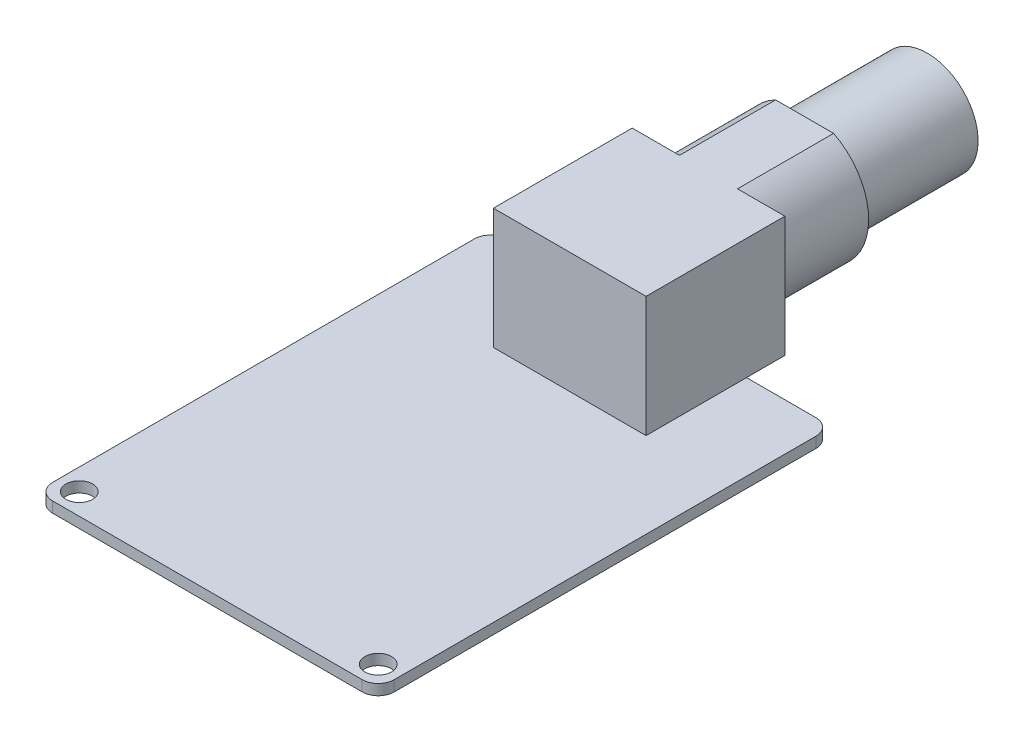
ISO-10303-21;
HEADER;
FILE_DESCRIPTION(('STEP AP214'),'2;1');
FILE_NAME('part.step','',(''),(''),'','','');
FILE_SCHEMA(('AUTOMOTIVE_DESIGN { 1 0 10303 214 1 1 1 1 }'));
ENDSEC;
DATA;
#1=APPLICATION_CONTEXT('core data for automotive mechanical design processes');
#2=APPLICATION_PROTOCOL_DEFINITION('international standard','automotive_design',2000,#1);
#3=PRODUCT_CONTEXT('',#1,'mechanical');
#4=PRODUCT('Part','Part','',(#3));
#5=PRODUCT_RELATED_PRODUCT_CATEGORY('part','',(#4));
#6=PRODUCT_DEFINITION_FORMATION('','',#4);
#7=PRODUCT_DEFINITION_CONTEXT('part definition',#1,'design');
#8=PRODUCT_DEFINITION('design','',#6,#7);
#9=PRODUCT_DEFINITION_SHAPE('','',#8);
#10=(LENGTH_UNIT() NAMED_UNIT(*) SI_UNIT(.MILLI.,.METRE.));
#11=(NAMED_UNIT(*) PLANE_ANGLE_UNIT() SI_UNIT($,.RADIAN.));
#12=(NAMED_UNIT(*) SI_UNIT($,.STERADIAN.) SOLID_ANGLE_UNIT());
#13=UNCERTAINTY_MEASURE_WITH_UNIT(LENGTH_MEASURE(1.E-05),#10,'distance_accuracy_value','');
#14=(GEOMETRIC_REPRESENTATION_CONTEXT(3) GLOBAL_UNCERTAINTY_ASSIGNED_CONTEXT((#13)) GLOBAL_UNIT_ASSIGNED_CONTEXT((#10,
#11,#12)) REPRESENTATION_CONTEXT('',''));
#15=CARTESIAN_POINT('',(0.,0.,0.));
#16=DIRECTION('',(0.,0.,1.));
#17=DIRECTION('',(1.,0.,0.));
#18=AXIS2_PLACEMENT_3D('',#15,#16,#17);
#19=CARTESIAN_POINT('',(-71.4909090909091,25.55,16.5));
#20=DIRECTION('',(0.,1.,0.));
#21=DIRECTION('',(0.,0.,1.));
#22=AXIS2_PLACEMENT_3D('',#19,#20,#21);
#23=PLANE('',#22);
#24=DIRECTION('',(1.,0.,0.));
#25=VECTOR('',#24,1.);
#26=CARTESIAN_POINT('',(-50.6909090909091,25.55,7.08792056437034));
#27=LINE('',#26,#25);
#28=CARTESIAN_POINT('',(-71.4909090909091,25.55,7.08792056437033));
#29=VERTEX_POINT('',#28);
#30=CARTESIAN_POINT('',(-57.1909090909091,25.55,7.08792056437033));
#31=VERTEX_POINT('',#30);
#32=EDGE_CURVE('E240',#29,#31,#27,.T.);
#33=ORIENTED_EDGE('',*,*,#32,.F.);
#34=DIRECTION('',(0.,0.,-1.));
#35=VECTOR('',#34,1.);
#36=CARTESIAN_POINT('',(-71.4909090909091,25.55,16.5));
#37=LINE('',#36,#35);
#38=CARTESIAN_POINT('',(-71.4909090909091,25.55,3.5));
#39=VERTEX_POINT('',#38);
#40=EDGE_CURVE('E164',#29,#39,#37,.T.);
#41=ORIENTED_EDGE('',*,*,#40,.T.);
#42=DIRECTION('',(1.,0.,0.));
#43=VECTOR('',#42,1.);
#44=CARTESIAN_POINT('',(-71.4909090909091,25.55,3.5));
#45=LINE('',#44,#43);
#46=CARTESIAN_POINT('',(-65.1138903325962,25.55,3.5));
#47=VERTEX_POINT('',#46);
#48=EDGE_CURVE('E184',#39,#47,#45,.T.);
#49=ORIENTED_EDGE('',*,*,#48,.T.);
#50=CARTESIAN_POINT('',(-63.567927849222,25.55,3.5));
#51=VERTEX_POINT('',#50);
#52=EDGE_CURVE('E42',#47,#51,#45,.T.);
#53=ORIENTED_EDGE('',*,*,#52,.T.);
#54=CARTESIAN_POINT('',(-57.1909090909091,25.55,3.5));
#55=VERTEX_POINT('',#54);
#56=EDGE_CURVE('E187',#51,#55,#45,.T.);
#57=ORIENTED_EDGE('',*,*,#56,.T.);
#58=DIRECTION('',(0.,0.,-1.));
#59=VECTOR('',#58,1.);
#60=CARTESIAN_POINT('',(-57.1909090909091,25.55,16.5));
#61=LINE('',#60,#59);
#62=EDGE_CURVE('E170',#31,#55,#61,.T.);
#63=ORIENTED_EDGE('',*,*,#62,.F.);
#64=EDGE_LOOP('',(#33,#41,#49,#53,#57,#63));
#65=FACE_BOUND('',#64,.T.);
#66=ADVANCED_FACE('F33',(#65),#23,.F.);
#67=CARTESIAN_POINT('',(-64.3409090909091,31.5,3.5));
#68=DIRECTION('',(0.,0.,-1.));
#69=DIRECTION('',(-1.,0.,0.));
#70=AXIS2_PLACEMENT_3D('',#67,#68,#69);
#71=CYLINDRICAL_SURFACE('',#70,6.);
#72=CARTESIAN_POINT('',(-64.3409090909091,31.5,3.5));
#73=DIRECTION('',(0.,0.,1.));
#74=DIRECTION('',(1.,0.,0.));
#75=AXIS2_PLACEMENT_3D('',#72,#73,#74);
#76=CIRCLE('',#75,6.);
#77=CARTESIAN_POINT('',(-67.0570644620173,36.85,3.5));
#78=VERTEX_POINT('',#77);
#79=EDGE_CURVE('E157',#78,#47,#76,.T.);
#80=ORIENTED_EDGE('',*,*,#79,.F.);
#81=DIRECTION('',(0.,0.,1.));
#82=VECTOR('',#81,1.);
#83=CARTESIAN_POINT('',(-67.0570644620173,36.85,-17.001));
#84=LINE('',#83,#82);
#85=CARTESIAN_POINT('',(-67.0570644620173,36.85,-5.5));
#86=VERTEX_POINT('',#85);
#87=EDGE_CURVE('E56',#86,#78,#84,.T.);
#88=ORIENTED_EDGE('',*,*,#87,.F.);
#89=CARTESIAN_POINT('',(-64.3409090909091,31.5,-5.5));
#90=DIRECTION('',(0.,0.,1.));
#91=DIRECTION('',(1.,0.,0.));
#92=AXIS2_PLACEMENT_3D('',#89,#90,#91);
#93=CIRCLE('',#92,6.);
#94=CARTESIAN_POINT('',(-61.6247537198009,36.85,-5.5));
#95=VERTEX_POINT('',#94);
#96=EDGE_CURVE('E155',#86,#95,#93,.T.);
#97=ORIENTED_EDGE('',*,*,#96,.T.);
#98=DIRECTION('',(0.,0.,1.));
#99=VECTOR('',#98,1.);
#100=CARTESIAN_POINT('',(-61.6247537198009,36.85,-17.001));
#101=LINE('',#100,#99);
#102=CARTESIAN_POINT('',(-61.6247537198009,36.85,3.5));
#103=VERTEX_POINT('',#102);
#104=EDGE_CURVE('E148',#95,#103,#101,.T.);
#105=ORIENTED_EDGE('',*,*,#104,.T.);
#106=EDGE_CURVE('E37',#51,#103,#76,.T.);
#107=ORIENTED_EDGE('',*,*,#106,.F.);
#108=EDGE_CURVE('E163',#47,#51,#76,.T.);
#109=ORIENTED_EDGE('',*,*,#108,.F.);
#110=EDGE_LOOP('',(#80,#88,#97,#105,#107,#109));
#111=FACE_BOUND('',#110,.T.);
#112=ADVANCED_FACE('F35',(#111),#71,.T.);
#113=CARTESIAN_POINT('',(-64.3409090909091,31.5,3.5));
#114=DIRECTION('',(0.,0.,1.));
#115=DIRECTION('',(1.,0.,0.));
#116=AXIS2_PLACEMENT_3D('',#113,#114,#115);
#117=PLANE('',#116);
#118=ORIENTED_EDGE('',*,*,#52,.F.);
#119=ORIENTED_EDGE('',*,*,#108,.T.);
#120=EDGE_LOOP('',(#118,#119));
#121=FACE_BOUND('',#120,.T.);
#122=ADVANCED_FACE('F298',(#121),#117,.T.);
#123=CARTESIAN_POINT('',(-64.3409090909091,31.5,-5.5));
#124=DIRECTION('',(0.,0.,1.));
#125=DIRECTION('',(1.,0.,0.));
#126=AXIS2_PLACEMENT_3D('',#123,#124,#125);
#127=PLANE('',#126);
#128=CARTESIAN_POINT('',(-64.3409090909091,31.5,-5.5));
#129=DIRECTION('',(0.,0.,-1.));
#130=DIRECTION('',(-1.,0.,0.));
#131=AXIS2_PLACEMENT_3D('',#128,#129,#130);
#132=CIRCLE('',#131,4.75000000000001);
#133=CARTESIAN_POINT('',(-69.0909090909091,31.5,-5.5));
#134=VERTEX_POINT('',#133);
#135=EDGE_CURVE('E11',#134,#134,#132,.T.);
#136=ORIENTED_EDGE('',*,*,#135,.F.);
#137=EDGE_LOOP('',(#136));
#138=FACE_BOUND('',#137,.T.);
#139=ORIENTED_EDGE('',*,*,#96,.F.);
#140=DIRECTION('',(-1.,0.,0.));
#141=VECTOR('',#140,1.);
#142=CARTESIAN_POINT('',(-67.0570644620173,36.85,-5.5));
#143=LINE('',#142,#141);
#144=EDGE_CURVE('E145',#95,#86,#143,.T.);
#145=ORIENTED_EDGE('',*,*,#144,.F.);
#146=EDGE_LOOP('',(#139,#145));
#147=FACE_BOUND('',#146,.T.);
#148=ADVANCED_FACE('F160',(#138,#147),#127,.F.);
#149=CARTESIAN_POINT('',(0.,0.,3.5));
#150=DIRECTION('',(0.,0.,1.));
#151=DIRECTION('',(1.,0.,0.));
#152=AXIS2_PLACEMENT_3D('',#149,#150,#151);
#153=PLANE('',#152);
#154=DIRECTION('',(-1.,0.,0.));
#155=VECTOR('',#154,1.);
#156=CARTESIAN_POINT('',(-71.4909090909091,36.85,3.5));
#157=LINE('',#156,#155);
#158=CARTESIAN_POINT('',(-71.4909090909091,36.85,3.5));
#159=VERTEX_POINT('',#158);
#160=EDGE_CURVE('E181',#78,#159,#157,.T.);
#161=ORIENTED_EDGE('',*,*,#160,.F.);
#162=ORIENTED_EDGE('',*,*,#79,.T.);
#163=ORIENTED_EDGE('',*,*,#48,.F.);
#164=DIRECTION('',(0.,-1.,0.));
#165=VECTOR('',#164,1.);
#166=CARTESIAN_POINT('',(-71.4909090909091,36.85,3.5));
#167=LINE('',#166,#165);
#168=EDGE_CURVE('E188',#159,#39,#167,.T.);
#169=ORIENTED_EDGE('',*,*,#168,.F.);
#170=EDGE_LOOP('',(#161,#162,#163,#169));
#171=FACE_BOUND('',#170,.T.);
#172=ADVANCED_FACE('F305',(#171),#153,.F.);
#173=ORIENTED_EDGE('',*,*,#56,.F.);
#174=ORIENTED_EDGE('',*,*,#106,.T.);
#175=CARTESIAN_POINT('',(-57.1909090909091,36.85,3.5));
#176=VERTEX_POINT('',#175);
#177=EDGE_CURVE('E178',#176,#103,#157,.T.);
#178=ORIENTED_EDGE('',*,*,#177,.F.);
#179=DIRECTION('',(0.,1.,0.));
#180=VECTOR('',#179,1.);
#181=CARTESIAN_POINT('',(-57.1909090909091,36.85,3.5));
#182=LINE('',#181,#180);
#183=EDGE_CURVE('E182',#55,#176,#182,.T.);
#184=ORIENTED_EDGE('',*,*,#183,.F.);
#185=EDGE_LOOP('',(#173,#174,#178,#184));
#186=FACE_BOUND('',#185,.T.);
#187=ADVANCED_FACE('F284',(#186),#153,.F.);
#188=CARTESIAN_POINT('',(-71.4909090909091,36.85,16.5));
#189=DIRECTION('',(1.,0.,0.));
#190=DIRECTION('',(0.,0.,-1.));
#191=AXIS2_PLACEMENT_3D('',#188,#189,#190);
#192=PLANE('',#191);
#193=ORIENTED_EDGE('',*,*,#168,.T.);
#194=ORIENTED_EDGE('',*,*,#40,.F.);
#195=CARTESIAN_POINT('',(-71.4909090909091,25.55,16.5));
#196=VERTEX_POINT('',#195);
#197=EDGE_CURVE('E161',#196,#29,#37,.T.);
#198=ORIENTED_EDGE('',*,*,#197,.F.);
#199=DIRECTION('',(0.,-1.,0.));
#200=VECTOR('',#199,1.);
#201=CARTESIAN_POINT('',(-71.4909090909091,36.85,16.5));
#202=LINE('',#201,#200);
#203=CARTESIAN_POINT('',(-71.4909090909091,36.85,16.5));
#204=VERTEX_POINT('',#203);
#205=EDGE_CURVE('E180',#204,#196,#202,.T.);
#206=ORIENTED_EDGE('',*,*,#205,.F.);
#207=DIRECTION('',(0.,0.,-1.));
#208=VECTOR('',#207,1.);
#209=CARTESIAN_POINT('',(-71.4909090909091,36.85,16.5));
#210=LINE('',#209,#208);
#211=EDGE_CURVE('E174',#204,#159,#210,.T.);
#212=ORIENTED_EDGE('',*,*,#211,.T.);
#213=EDGE_LOOP('',(#193,#194,#198,#206,#212));
#214=FACE_BOUND('',#213,.T.);
#215=ADVANCED_FACE('F316',(#214),#192,.F.);
#216=CARTESIAN_POINT('',(-57.1909090909091,36.85,16.5));
#217=DIRECTION('',(-1.,0.,0.));
#218=DIRECTION('',(0.,0.,1.));
#219=AXIS2_PLACEMENT_3D('',#216,#217,#218);
#220=PLANE('',#219);
#221=ORIENTED_EDGE('',*,*,#183,.T.);
#222=DIRECTION('',(0.,0.,-1.));
#223=VECTOR('',#222,1.);
#224=CARTESIAN_POINT('',(-57.1909090909091,36.85,16.5));
#225=LINE('',#224,#223);
#226=CARTESIAN_POINT('',(-57.1909090909091,36.85,16.5));
#227=VERTEX_POINT('',#226);
#228=EDGE_CURVE('E171',#227,#176,#225,.T.);
#229=ORIENTED_EDGE('',*,*,#228,.F.);
#230=DIRECTION('',(0.,1.,0.));
#231=VECTOR('',#230,1.);
#232=CARTESIAN_POINT('',(-57.1909090909091,36.85,16.5));
#233=LINE('',#232,#231);
#234=CARTESIAN_POINT('',(-57.1909090909091,25.55,16.5));
#235=VERTEX_POINT('',#234);
#236=EDGE_CURVE('E193',#235,#227,#233,.T.);
#237=ORIENTED_EDGE('',*,*,#236,.F.);
#238=EDGE_CURVE('E167',#235,#31,#61,.T.);
#239=ORIENTED_EDGE('',*,*,#238,.T.);
#240=ORIENTED_EDGE('',*,*,#62,.T.);
#241=EDGE_LOOP('',(#221,#229,#237,#239,#240));
#242=FACE_BOUND('',#241,.T.);
#243=ADVANCED_FACE('F292',(#242),#220,.F.);
#244=CARTESIAN_POINT('',(-71.4909090909091,36.85,16.5));
#245=DIRECTION('',(0.,-1.,0.));
#246=DIRECTION('',(0.,0.,-1.));
#247=AXIS2_PLACEMENT_3D('',#244,#245,#246);
#248=PLANE('',#247);
#249=ORIENTED_EDGE('',*,*,#177,.T.);
#250=ORIENTED_EDGE('',*,*,#104,.F.);
#251=ORIENTED_EDGE('',*,*,#144,.T.);
#252=ORIENTED_EDGE('',*,*,#87,.T.);
#253=ORIENTED_EDGE('',*,*,#160,.T.);
#254=ORIENTED_EDGE('',*,*,#211,.F.);
#255=DIRECTION('',(-1.,0.,0.));
#256=VECTOR('',#255,1.);
#257=CARTESIAN_POINT('',(-71.4909090909091,36.85,16.5));
#258=LINE('',#257,#256);
#259=EDGE_CURVE('E177',#227,#204,#258,.T.);
#260=ORIENTED_EDGE('',*,*,#259,.F.);
#261=ORIENTED_EDGE('',*,*,#228,.T.);
#262=EDGE_LOOP('',(#249,#250,#251,#252,#253,#254,#260,#261));
#263=FACE_BOUND('',#262,.T.);
#264=ADVANCED_FACE('F147',(#263),#248,.F.);
#265=CARTESIAN_POINT('',(0.,0.,16.5));
#266=DIRECTION('',(0.,0.,1.));
#267=DIRECTION('',(1.,0.,0.));
#268=AXIS2_PLACEMENT_3D('',#265,#266,#267);
#269=PLANE('',#268);
#270=ORIENTED_EDGE('',*,*,#205,.T.);
#271=DIRECTION('',(1.,0.,0.));
#272=VECTOR('',#271,1.);
#273=CARTESIAN_POINT('',(-71.4909090909091,25.55,16.5));
#274=LINE('',#273,#272);
#275=EDGE_CURVE('E195',#196,#235,#274,.T.);
#276=ORIENTED_EDGE('',*,*,#275,.T.);
#277=ORIENTED_EDGE('',*,*,#236,.T.);
#278=ORIENTED_EDGE('',*,*,#259,.T.);
#279=EDGE_LOOP('',(#270,#276,#277,#278));
#280=FACE_BOUND('',#279,.T.);
#281=ADVANCED_FACE('F365',(#280),#269,.T.);
#282=CARTESIAN_POINT('',(-79.6909090909091,25.55,8.58792056437033));
#283=DIRECTION('',(0.,1.,0.));
#284=DIRECTION('',(0.,0.,1.));
#285=AXIS2_PLACEMENT_3D('',#282,#283,#284);
#286=PLANE('',#285);
#287=CARTESIAN_POINT('',(-79.1909090909091,25.55,47.5879205643703));
#288=DIRECTION('',(0.,-1.,0.));
#289=DIRECTION('',(0.,0.,-1.));
#290=AXIS2_PLACEMENT_3D('',#287,#288,#289);
#291=CIRCLE('',#290,1.25);
#292=CARTESIAN_POINT('',(-79.1909090909091,25.55,46.3379205643703));
#293=VERTEX_POINT('',#292);
#294=EDGE_CURVE('E267',#293,#293,#291,.T.);
#295=ORIENTED_EDGE('',*,*,#294,.T.);
#296=EDGE_LOOP('',(#295));
#297=FACE_BOUND('',#296,.T.);
#298=CARTESIAN_POINT('',(-51.1909090909091,25.55,47.5879205643703));
#299=DIRECTION('',(0.,-1.,0.));
#300=DIRECTION('',(0.,0.,-1.));
#301=AXIS2_PLACEMENT_3D('',#298,#299,#300);
#302=CIRCLE('',#301,1.25);
#303=CARTESIAN_POINT('',(-51.1909090909091,25.55,46.3379205643703));
#304=VERTEX_POINT('',#303);
#305=EDGE_CURVE('E261',#304,#304,#302,.T.);
#306=ORIENTED_EDGE('',*,*,#305,.T.);
#307=EDGE_LOOP('',(#306));
#308=FACE_BOUND('',#307,.T.);
#309=ORIENTED_EDGE('',*,*,#197,.T.);
#310=CARTESIAN_POINT('',(-79.6909090909091,25.55,7.08792056437033));
#311=VERTEX_POINT('',#310);
#312=EDGE_CURVE('E237',#311,#29,#27,.T.);
#313=ORIENTED_EDGE('',*,*,#312,.F.);
#314=CARTESIAN_POINT('',(-79.6909090909091,25.55,8.58792056437033));
#315=DIRECTION('',(0.,-1.,0.));
#316=DIRECTION('',(0.,0.,1.));
#317=AXIS2_PLACEMENT_3D('',#314,#315,#316);
#318=CIRCLE('',#317,1.5);
#319=CARTESIAN_POINT('',(-81.1909090909091,25.55,8.58792056437034));
#320=VERTEX_POINT('',#319);
#321=EDGE_CURVE('E242',#320,#311,#318,.T.);
#322=ORIENTED_EDGE('',*,*,#321,.F.);
#323=DIRECTION('',(0.,0.,-1.));
#324=VECTOR('',#323,1.);
#325=CARTESIAN_POINT('',(-81.1909090909091,25.55,8.58792056437034));
#326=LINE('',#325,#324);
#327=CARTESIAN_POINT('',(-81.1909090909091,25.55,48.0879205643703));
#328=VERTEX_POINT('',#327);
#329=EDGE_CURVE('E224',#328,#320,#326,.T.);
#330=ORIENTED_EDGE('',*,*,#329,.F.);
#331=CARTESIAN_POINT('',(-79.6909090909091,25.55,48.0879205643703));
#332=DIRECTION('',(0.,-1.,0.));
#333=DIRECTION('',(0.,0.,-1.));
#334=AXIS2_PLACEMENT_3D('',#331,#332,#333);
#335=CIRCLE('',#334,1.5);
#336=CARTESIAN_POINT('',(-79.6909090909091,25.55,49.5879205643703));
#337=VERTEX_POINT('',#336);
#338=EDGE_CURVE('E227',#337,#328,#335,.T.);
#339=ORIENTED_EDGE('',*,*,#338,.F.);
#340=DIRECTION('',(-1.,0.,0.));
#341=VECTOR('',#340,1.);
#342=CARTESIAN_POINT('',(-50.6909090909091,25.55,49.5879205643703));
#343=LINE('',#342,#341);
#344=CARTESIAN_POINT('',(-50.6909090909091,25.55,49.5879205643703));
#345=VERTEX_POINT('',#344);
#346=EDGE_CURVE('E229',#345,#337,#343,.T.);
#347=ORIENTED_EDGE('',*,*,#346,.F.);
#348=CARTESIAN_POINT('',(-50.6909090909091,25.55,48.0879205643703));
#349=DIRECTION('',(0.,-1.,0.));
#350=DIRECTION('',(0.,0.,-1.));
#351=AXIS2_PLACEMENT_3D('',#348,#349,#350);
#352=CIRCLE('',#351,1.5);
#353=CARTESIAN_POINT('',(-49.1909090909091,25.55,48.0879205643703));
#354=VERTEX_POINT('',#353);
#355=EDGE_CURVE('E231',#354,#345,#352,.T.);
#356=ORIENTED_EDGE('',*,*,#355,.F.);
#357=DIRECTION('',(0.,0.,1.));
#358=VECTOR('',#357,1.);
#359=CARTESIAN_POINT('',(-49.1909090909091,25.55,8.58792056437035));
#360=LINE('',#359,#358);
#361=CARTESIAN_POINT('',(-49.1909090909091,25.55,8.58792056437035));
#362=VERTEX_POINT('',#361);
#363=EDGE_CURVE('E233',#362,#354,#360,.T.);
#364=ORIENTED_EDGE('',*,*,#363,.F.);
#365=CARTESIAN_POINT('',(-50.6909090909091,25.55,8.58792056437034));
#366=DIRECTION('',(0.,-1.,0.));
#367=DIRECTION('',(0.,0.,-1.));
#368=AXIS2_PLACEMENT_3D('',#365,#366,#367);
#369=CIRCLE('',#368,1.5);
#370=CARTESIAN_POINT('',(-50.6909090909091,25.55,7.08792056437034));
#371=VERTEX_POINT('',#370);
#372=EDGE_CURVE('E235',#371,#362,#369,.T.);
#373=ORIENTED_EDGE('',*,*,#372,.F.);
#374=EDGE_CURVE('E241',#31,#371,#27,.T.);
#375=ORIENTED_EDGE('',*,*,#374,.F.);
#376=ORIENTED_EDGE('',*,*,#238,.F.);
#377=ORIENTED_EDGE('',*,*,#275,.F.);
#378=EDGE_LOOP('',(#309,#313,#322,#330,#339,#347,#356,#364,#373,#375,#376,#377));
#379=FACE_BOUND('',#378,.T.);
#380=ADVANCED_FACE('F340',(#297,#308,#379),#286,.T.);
#381=CARTESIAN_POINT('',(-79.6909090909091,24.55,8.58792056437033));
#382=DIRECTION('',(0.,1.,0.));
#383=DIRECTION('',(0.,0.,1.));
#384=AXIS2_PLACEMENT_3D('',#381,#382,#383);
#385=PLANE('',#384);
#386=CARTESIAN_POINT('',(-79.6909090909091,24.55,8.58792056437033));
#387=DIRECTION('',(0.,-1.,0.));
#388=DIRECTION('',(0.,0.,1.));
#389=AXIS2_PLACEMENT_3D('',#386,#387,#388);
#390=CIRCLE('',#389,1.5);
#391=CARTESIAN_POINT('',(-81.1909090909091,24.55,8.58792056437034));
#392=VERTEX_POINT('',#391);
#393=CARTESIAN_POINT('',(-79.6909090909091,24.55,7.08792056437033));
#394=VERTEX_POINT('',#393);
#395=EDGE_CURVE('E226',#392,#394,#390,.T.);
#396=ORIENTED_EDGE('',*,*,#395,.T.);
#397=DIRECTION('',(1.,0.,0.));
#398=VECTOR('',#397,1.);
#399=CARTESIAN_POINT('',(-50.6909090909091,24.55,7.08792056437034));
#400=LINE('',#399,#398);
#401=CARTESIAN_POINT('',(-50.6909090909091,24.55,7.08792056437034));
#402=VERTEX_POINT('',#401);
#403=EDGE_CURVE('E257',#394,#402,#400,.T.);
#404=ORIENTED_EDGE('',*,*,#403,.T.);
#405=CARTESIAN_POINT('',(-50.6909090909091,24.55,8.58792056437034));
#406=DIRECTION('',(0.,-1.,0.));
#407=DIRECTION('',(0.,0.,-1.));
#408=AXIS2_PLACEMENT_3D('',#405,#406,#407);
#409=CIRCLE('',#408,1.5);
#410=CARTESIAN_POINT('',(-49.1909090909091,24.55,8.58792056437035));
#411=VERTEX_POINT('',#410);
#412=EDGE_CURVE('E255',#402,#411,#409,.T.);
#413=ORIENTED_EDGE('',*,*,#412,.T.);
#414=DIRECTION('',(0.,0.,1.));
#415=VECTOR('',#414,1.);
#416=CARTESIAN_POINT('',(-49.1909090909091,24.55,8.58792056437035));
#417=LINE('',#416,#415);
#418=CARTESIAN_POINT('',(-49.1909090909091,24.55,48.0879205643703));
#419=VERTEX_POINT('',#418);
#420=EDGE_CURVE('E253',#411,#419,#417,.T.);
#421=ORIENTED_EDGE('',*,*,#420,.T.);
#422=CARTESIAN_POINT('',(-50.6909090909091,24.55,48.0879205643703));
#423=DIRECTION('',(0.,-1.,0.));
#424=DIRECTION('',(0.,0.,-1.));
#425=AXIS2_PLACEMENT_3D('',#422,#423,#424);
#426=CIRCLE('',#425,1.5);
#427=CARTESIAN_POINT('',(-50.6909090909091,24.55,49.5879205643703));
#428=VERTEX_POINT('',#427);
#429=EDGE_CURVE('E251',#419,#428,#426,.T.);
#430=ORIENTED_EDGE('',*,*,#429,.T.);
#431=DIRECTION('',(-1.,0.,0.));
#432=VECTOR('',#431,1.);
#433=CARTESIAN_POINT('',(-50.6909090909091,24.55,49.5879205643703));
#434=LINE('',#433,#432);
#435=CARTESIAN_POINT('',(-79.6909090909091,24.55,49.5879205643703));
#436=VERTEX_POINT('',#435);
#437=EDGE_CURVE('E249',#428,#436,#434,.T.);
#438=ORIENTED_EDGE('',*,*,#437,.T.);
#439=CARTESIAN_POINT('',(-79.6909090909091,24.55,48.0879205643703));
#440=DIRECTION('',(0.,-1.,0.));
#441=DIRECTION('',(0.,0.,-1.));
#442=AXIS2_PLACEMENT_3D('',#439,#440,#441);
#443=CIRCLE('',#442,1.5);
#444=CARTESIAN_POINT('',(-81.1909090909091,24.55,48.0879205643703));
#445=VERTEX_POINT('',#444);
#446=EDGE_CURVE('E247',#436,#445,#443,.T.);
#447=ORIENTED_EDGE('',*,*,#446,.T.);
#448=DIRECTION('',(0.,0.,-1.));
#449=VECTOR('',#448,1.);
#450=CARTESIAN_POINT('',(-81.1909090909091,24.55,8.58792056437034));
#451=LINE('',#450,#449);
#452=EDGE_CURVE('E223',#445,#392,#451,.T.);
#453=ORIENTED_EDGE('',*,*,#452,.T.);
#454=EDGE_LOOP('',(#396,#404,#413,#421,#430,#438,#447,#453));
#455=FACE_BOUND('',#454,.T.);
#456=CARTESIAN_POINT('',(-51.1909090909091,24.55,47.5879205643703));
#457=DIRECTION('',(0.,-1.,0.));
#458=DIRECTION('',(0.,0.,-1.));
#459=AXIS2_PLACEMENT_3D('',#456,#457,#458);
#460=CIRCLE('',#459,1.25);
#461=CARTESIAN_POINT('',(-51.1909090909091,24.55,46.3379205643703));
#462=VERTEX_POINT('',#461);
#463=EDGE_CURVE('E245',#462,#462,#460,.T.);
#464=ORIENTED_EDGE('',*,*,#463,.F.);
#465=EDGE_LOOP('',(#464));
#466=FACE_BOUND('',#465,.T.);
#467=CARTESIAN_POINT('',(-79.1909090909091,24.55,47.5879205643703));
#468=DIRECTION('',(0.,-1.,0.));
#469=DIRECTION('',(0.,0.,-1.));
#470=AXIS2_PLACEMENT_3D('',#467,#468,#469);
#471=CIRCLE('',#470,1.25);
#472=CARTESIAN_POINT('',(-79.1909090909091,24.55,46.3379205643703));
#473=VERTEX_POINT('',#472);
#474=EDGE_CURVE('E264',#473,#473,#471,.T.);
#475=ORIENTED_EDGE('',*,*,#474,.F.);
#476=EDGE_LOOP('',(#475));
#477=FACE_BOUND('',#476,.T.);
#478=ADVANCED_FACE('F353',(#455,#466,#477),#385,.F.);
#479=CARTESIAN_POINT('',(-79.6909090909091,24.55,8.58792056437033));
#480=DIRECTION('',(0.,1.,0.));
#481=DIRECTION('',(0.,0.,1.));
#482=AXIS2_PLACEMENT_3D('',#479,#480,#481);
#483=CYLINDRICAL_SURFACE('',#482,1.5);
#484=ORIENTED_EDGE('',*,*,#321,.T.);
#485=DIRECTION('',(0.,1.,0.));
#486=VECTOR('',#485,1.);
#487=CARTESIAN_POINT('',(-79.6909090909091,24.55,7.08792056437033));
#488=LINE('',#487,#486);
#489=EDGE_CURVE('E191',#394,#311,#488,.T.);
#490=ORIENTED_EDGE('',*,*,#489,.F.);
#491=ORIENTED_EDGE('',*,*,#395,.F.);
#492=DIRECTION('',(0.,1.,0.));
#493=VECTOR('',#492,1.);
#494=CARTESIAN_POINT('',(-81.1909090909091,24.55,8.58792056437034));
#495=LINE('',#494,#493);
#496=EDGE_CURVE('E220',#392,#320,#495,.T.);
#497=ORIENTED_EDGE('',*,*,#496,.T.);
#498=EDGE_LOOP('',(#484,#490,#491,#497));
#499=FACE_BOUND('',#498,.T.);
#500=ADVANCED_FACE('F360',(#499),#483,.T.);
#501=CARTESIAN_POINT('',(-50.6909090909091,24.55,7.08792056437034));
#502=DIRECTION('',(0.,0.,1.));
#503=DIRECTION('',(1.,0.,0.));
#504=AXIS2_PLACEMENT_3D('',#501,#502,#503);
#505=PLANE('',#504);
#506=ORIENTED_EDGE('',*,*,#312,.T.);
#507=ORIENTED_EDGE('',*,*,#32,.T.);
#508=ORIENTED_EDGE('',*,*,#374,.T.);
#509=DIRECTION('',(0.,1.,0.));
#510=VECTOR('',#509,1.);
#511=CARTESIAN_POINT('',(-50.6909090909091,24.55,7.08792056437034));
#512=LINE('',#511,#510);
#513=EDGE_CURVE('E202',#402,#371,#512,.T.);
#514=ORIENTED_EDGE('',*,*,#513,.F.);
#515=ORIENTED_EDGE('',*,*,#403,.F.);
#516=ORIENTED_EDGE('',*,*,#489,.T.);
#517=EDGE_LOOP('',(#506,#507,#508,#514,#515,#516));
#518=FACE_BOUND('',#517,.T.);
#519=ADVANCED_FACE('F332',(#518),#505,.F.);
#520=CARTESIAN_POINT('',(-50.6909090909091,24.55,8.58792056437034));
#521=DIRECTION('',(0.,1.,0.));
#522=DIRECTION('',(0.,0.,1.));
#523=AXIS2_PLACEMENT_3D('',#520,#521,#522);
#524=CYLINDRICAL_SURFACE('',#523,1.5);
#525=ORIENTED_EDGE('',*,*,#372,.T.);
#526=DIRECTION('',(0.,1.,0.));
#527=VECTOR('',#526,1.);
#528=CARTESIAN_POINT('',(-49.1909090909091,24.55,8.58792056437035));
#529=LINE('',#528,#527);
#530=EDGE_CURVE('E205',#411,#362,#529,.T.);
#531=ORIENTED_EDGE('',*,*,#530,.F.);
#532=ORIENTED_EDGE('',*,*,#412,.F.);
#533=ORIENTED_EDGE('',*,*,#513,.T.);
#534=EDGE_LOOP('',(#525,#531,#532,#533));
#535=FACE_BOUND('',#534,.T.);
#536=ADVANCED_FACE('F337',(#535),#524,.T.);
#537=CARTESIAN_POINT('',(-49.1909090909091,24.55,8.58792056437035));
#538=DIRECTION('',(-1.,0.,0.));
#539=DIRECTION('',(0.,0.,1.));
#540=AXIS2_PLACEMENT_3D('',#537,#538,#539);
#541=PLANE('',#540);
#542=ORIENTED_EDGE('',*,*,#363,.T.);
#543=DIRECTION('',(0.,1.,0.));
#544=VECTOR('',#543,1.);
#545=CARTESIAN_POINT('',(-49.1909090909091,24.55,48.0879205643703));
#546=LINE('',#545,#544);
#547=EDGE_CURVE('E208',#419,#354,#546,.T.);
#548=ORIENTED_EDGE('',*,*,#547,.F.);
#549=ORIENTED_EDGE('',*,*,#420,.F.);
#550=ORIENTED_EDGE('',*,*,#530,.T.);
#551=EDGE_LOOP('',(#542,#548,#549,#550));
#552=FACE_BOUND('',#551,.T.);
#553=ADVANCED_FACE('F345',(#552),#541,.F.);
#554=CARTESIAN_POINT('',(-50.6909090909091,24.55,48.0879205643703));
#555=DIRECTION('',(0.,1.,0.));
#556=DIRECTION('',(0.,0.,1.));
#557=AXIS2_PLACEMENT_3D('',#554,#555,#556);
#558=CYLINDRICAL_SURFACE('',#557,1.5);
#559=ORIENTED_EDGE('',*,*,#355,.T.);
#560=DIRECTION('',(0.,1.,0.));
#561=VECTOR('',#560,1.);
#562=CARTESIAN_POINT('',(-50.6909090909091,24.55,49.5879205643703));
#563=LINE('',#562,#561);
#564=EDGE_CURVE('E211',#428,#345,#563,.T.);
#565=ORIENTED_EDGE('',*,*,#564,.F.);
#566=ORIENTED_EDGE('',*,*,#429,.F.);
#567=ORIENTED_EDGE('',*,*,#547,.T.);
#568=EDGE_LOOP('',(#559,#565,#566,#567));
#569=FACE_BOUND('',#568,.T.);
#570=ADVANCED_FACE('F349',(#569),#558,.T.);
#571=CARTESIAN_POINT('',(-50.6909090909091,24.55,49.5879205643703));
#572=DIRECTION('',(0.,0.,-1.));
#573=DIRECTION('',(-1.,0.,0.));
#574=AXIS2_PLACEMENT_3D('',#571,#572,#573);
#575=PLANE('',#574);
#576=ORIENTED_EDGE('',*,*,#346,.T.);
#577=DIRECTION('',(0.,1.,0.));
#578=VECTOR('',#577,1.);
#579=CARTESIAN_POINT('',(-79.6909090909091,24.55,49.5879205643703));
#580=LINE('',#579,#578);
#581=EDGE_CURVE('E214',#436,#337,#580,.T.);
#582=ORIENTED_EDGE('',*,*,#581,.F.);
#583=ORIENTED_EDGE('',*,*,#437,.F.);
#584=ORIENTED_EDGE('',*,*,#564,.T.);
#585=EDGE_LOOP('',(#576,#582,#583,#584));
#586=FACE_BOUND('',#585,.T.);
#587=ADVANCED_FACE('F453',(#586),#575,.F.);
#588=CARTESIAN_POINT('',(-79.6909090909091,24.55,48.0879205643703));
#589=DIRECTION('',(0.,1.,0.));
#590=DIRECTION('',(0.,0.,1.));
#591=AXIS2_PLACEMENT_3D('',#588,#589,#590);
#592=CYLINDRICAL_SURFACE('',#591,1.5);
#593=ORIENTED_EDGE('',*,*,#338,.T.);
#594=DIRECTION('',(0.,1.,0.));
#595=VECTOR('',#594,1.);
#596=CARTESIAN_POINT('',(-81.1909090909091,24.55,48.0879205643703));
#597=LINE('',#596,#595);
#598=EDGE_CURVE('E217',#445,#328,#597,.T.);
#599=ORIENTED_EDGE('',*,*,#598,.F.);
#600=ORIENTED_EDGE('',*,*,#446,.F.);
#601=ORIENTED_EDGE('',*,*,#581,.T.);
#602=EDGE_LOOP('',(#593,#599,#600,#601));
#603=FACE_BOUND('',#602,.T.);
#604=ADVANCED_FACE('F445',(#603),#592,.T.);
#605=CARTESIAN_POINT('',(-81.1909090909091,24.55,8.58792056437034));
#606=DIRECTION('',(1.,0.,0.));
#607=DIRECTION('',(0.,0.,-1.));
#608=AXIS2_PLACEMENT_3D('',#605,#606,#607);
#609=PLANE('',#608);
#610=ORIENTED_EDGE('',*,*,#329,.T.);
#611=ORIENTED_EDGE('',*,*,#496,.F.);
#612=ORIENTED_EDGE('',*,*,#452,.F.);
#613=ORIENTED_EDGE('',*,*,#598,.T.);
#614=EDGE_LOOP('',(#610,#611,#612,#613));
#615=FACE_BOUND('',#614,.T.);
#616=ADVANCED_FACE('F437',(#615),#609,.F.);
#617=CARTESIAN_POINT('',(-51.1909090909091,24.55,47.5879205643703));
#618=DIRECTION('',(0.,1.,0.));
#619=DIRECTION('',(0.,0.,1.));
#620=AXIS2_PLACEMENT_3D('',#617,#618,#619);
#621=CYLINDRICAL_SURFACE('',#620,1.25);
#622=ORIENTED_EDGE('',*,*,#463,.T.);
#623=EDGE_LOOP('',(#622));
#624=FACE_BOUND('',#623,.T.);
#625=ORIENTED_EDGE('',*,*,#305,.F.);
#626=EDGE_LOOP('',(#625));
#627=FACE_BOUND('',#626,.T.);
#628=ADVANCED_FACE('F429',(#624,#627),#621,.F.);
#629=CARTESIAN_POINT('',(-79.1909090909091,24.55,47.5879205643703));
#630=DIRECTION('',(0.,1.,0.));
#631=DIRECTION('',(0.,0.,1.));
#632=AXIS2_PLACEMENT_3D('',#629,#630,#631);
#633=CYLINDRICAL_SURFACE('',#632,1.25);
#634=ORIENTED_EDGE('',*,*,#474,.T.);
#635=EDGE_LOOP('',(#634));
#636=FACE_BOUND('',#635,.T.);
#637=ORIENTED_EDGE('',*,*,#294,.F.);
#638=EDGE_LOOP('',(#637));
#639=FACE_BOUND('',#638,.T.);
#640=ADVANCED_FACE('F421',(#636,#639),#633,.F.);
#641=CARTESIAN_POINT('',(-64.3409090909091,31.5,-17.));
#642=DIRECTION('',(0.,0.,1.));
#643=DIRECTION('',(1.,0.,0.));
#644=AXIS2_PLACEMENT_3D('',#641,#642,#643);
#645=CYLINDRICAL_SURFACE('',#644,4.75000000000001);
#646=CARTESIAN_POINT('',(-64.3409090909091,31.5,-17.));
#647=DIRECTION('',(0.,0.,-1.));
#648=DIRECTION('',(-1.,0.,0.));
#649=AXIS2_PLACEMENT_3D('',#646,#647,#648);
#650=CIRCLE('',#649,4.75000000000001);
#651=CARTESIAN_POINT('',(-69.0909090909091,31.5,-17.));
#652=VERTEX_POINT('',#651);
#653=EDGE_CURVE('E270',#652,#652,#650,.T.);
#654=ORIENTED_EDGE('',*,*,#653,.F.);
#655=EDGE_LOOP('',(#654));
#656=FACE_BOUND('',#655,.T.);
#657=ORIENTED_EDGE('',*,*,#135,.T.);
#658=EDGE_LOOP('',(#657));
#659=FACE_BOUND('',#658,.T.);
#660=ADVANCED_FACE('F413',(#656,#659),#645,.T.);
#661=CARTESIAN_POINT('',(-64.3409090909091,31.5,-17.));
#662=DIRECTION('',(0.,0.,-1.));
#663=DIRECTION('',(-1.,0.,0.));
#664=AXIS2_PLACEMENT_3D('',#661,#662,#663);
#665=PLANE('',#664);
#666=CARTESIAN_POINT('',(-64.3409090909091,31.5,-17.));
#667=DIRECTION('',(0.,0.,-1.));
#668=DIRECTION('',(-1.,0.,0.));
#669=AXIS2_PLACEMENT_3D('',#666,#667,#668);
#670=CIRCLE('',#669,4.25000000000001);
#671=CARTESIAN_POINT('',(-68.5909090909091,31.5,-17.));
#672=VERTEX_POINT('',#671);
#673=EDGE_CURVE('E152',#672,#672,#670,.T.);
#674=ORIENTED_EDGE('',*,*,#673,.F.);
#675=EDGE_LOOP('',(#674));
#676=FACE_BOUND('',#675,.T.);
#677=ORIENTED_EDGE('',*,*,#653,.T.);
#678=EDGE_LOOP('',(#677));
#679=FACE_BOUND('',#678,.T.);
#680=ADVANCED_FACE('F405',(#676,#679),#665,.T.);
#681=CARTESIAN_POINT('',(-64.3409090909091,31.5,-5.5));
#682=DIRECTION('',(0.,0.,-1.));
#683=DIRECTION('',(-1.,0.,0.));
#684=AXIS2_PLACEMENT_3D('',#681,#682,#683);
#685=CYLINDRICAL_SURFACE('',#684,4.25000000000001);
#686=CARTESIAN_POINT('',(-64.3409090909091,31.5,-5.5));
#687=DIRECTION('',(0.,0.,-1.));
#688=DIRECTION('',(-1.,0.,0.));
#689=AXIS2_PLACEMENT_3D('',#686,#687,#688);
#690=CIRCLE('',#689,4.25000000000001);
#691=CARTESIAN_POINT('',(-68.5909090909091,31.5,-5.5));
#692=VERTEX_POINT('',#691);
#693=EDGE_CURVE('E275',#692,#692,#690,.T.);
#694=ORIENTED_EDGE('',*,*,#693,.F.);
#695=EDGE_LOOP('',(#694));
#696=FACE_BOUND('',#695,.T.);
#697=ORIENTED_EDGE('',*,*,#673,.T.);
#698=EDGE_LOOP('',(#697));
#699=FACE_BOUND('',#698,.T.);
#700=ADVANCED_FACE('F398',(#696,#699),#685,.F.);
#701=CARTESIAN_POINT('',(-64.3409090909091,31.5,-5.5));
#702=DIRECTION('',(0.,0.,-1.));
#703=DIRECTION('',(-1.,0.,0.));
#704=AXIS2_PLACEMENT_3D('',#701,#702,#703);
#705=PLANE('',#704);
#706=ORIENTED_EDGE('',*,*,#693,.T.);
#707=EDGE_LOOP('',(#706));
#708=FACE_BOUND('',#707,.T.);
#709=ADVANCED_FACE('F394',(#708),#705,.T.);
#710=CLOSED_SHELL('',(#66,#112,#122,#148,#172,#187,#215,#243,#264,#281,#380,#478,#500,#519,#536,
#553,#570,#587,#604,#616,#628,#640,#660,#680,#700,#709));
#711=MANIFOLD_SOLID_BREP('B2',#710);
#712=ADVANCED_BREP_SHAPE_REPRESENTATION('',(#18,#711),#14);
#713=SHAPE_DEFINITION_REPRESENTATION(#9,#712);
ENDSEC;
END-ISO-10303-21;
